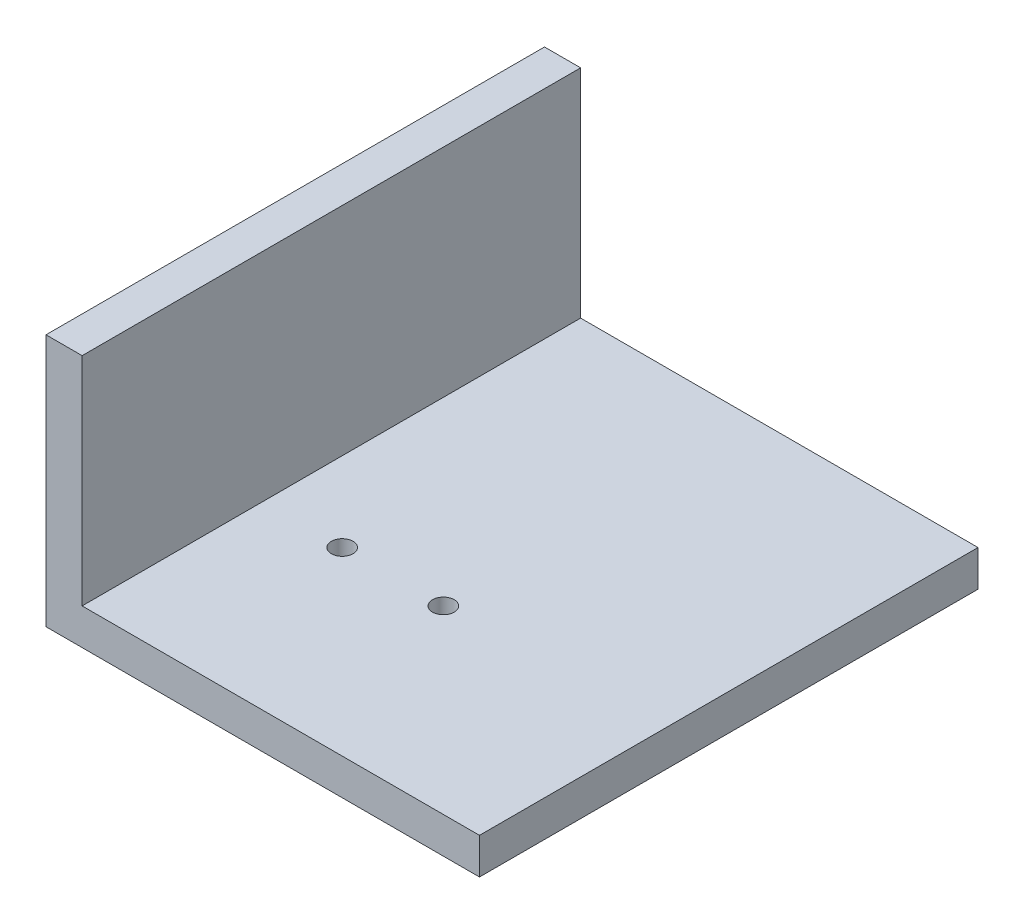
ISO-10303-21;
HEADER;
FILE_DESCRIPTION(('STEP AP214'),'2;1');
FILE_NAME('part.step','',(''),(''),'','','');
FILE_SCHEMA(('AUTOMOTIVE_DESIGN { 1 0 10303 214 1 1 1 1 }'));
ENDSEC;
DATA;
#1=APPLICATION_CONTEXT('core data for automotive mechanical design processes');
#2=APPLICATION_PROTOCOL_DEFINITION('international standard','automotive_design',2000,#1);
#3=PRODUCT_CONTEXT('',#1,'mechanical');
#4=PRODUCT('Part','Part','',(#3));
#5=PRODUCT_RELATED_PRODUCT_CATEGORY('part','',(#4));
#6=PRODUCT_DEFINITION_FORMATION('','',#4);
#7=PRODUCT_DEFINITION_CONTEXT('part definition',#1,'design');
#8=PRODUCT_DEFINITION('design','',#6,#7);
#9=PRODUCT_DEFINITION_SHAPE('','',#8);
#10=(LENGTH_UNIT() NAMED_UNIT(*) SI_UNIT(.MILLI.,.METRE.));
#11=(NAMED_UNIT(*) PLANE_ANGLE_UNIT() SI_UNIT($,.RADIAN.));
#12=(NAMED_UNIT(*) SI_UNIT($,.STERADIAN.) SOLID_ANGLE_UNIT());
#13=UNCERTAINTY_MEASURE_WITH_UNIT(LENGTH_MEASURE(1.E-05),#10,'distance_accuracy_value','');
#14=(GEOMETRIC_REPRESENTATION_CONTEXT(3) GLOBAL_UNCERTAINTY_ASSIGNED_CONTEXT((#13)) GLOBAL_UNIT_ASSIGNED_CONTEXT((#10,
#11,#12)) REPRESENTATION_CONTEXT('',''));
#15=CARTESIAN_POINT('',(0.,0.,0.));
#16=DIRECTION('',(0.,0.,1.));
#17=DIRECTION('',(1.,0.,0.));
#18=AXIS2_PLACEMENT_3D('',#15,#16,#17);
#19=CARTESIAN_POINT('',(0.,5.,0.));
#20=DIRECTION('',(0.,1.,0.));
#21=DIRECTION('',(0.,0.,1.));
#22=AXIS2_PLACEMENT_3D('',#19,#20,#21);
#23=PLANE('',#22);
#24=DIRECTION('',(0.,0.,-1.));
#25=VECTOR('',#24,1.);
#26=CARTESIAN_POINT('',(-11.,5.,-44.));
#27=LINE('',#26,#25);
#28=CARTESIAN_POINT('',(-11.,5.,25.));
#29=VERTEX_POINT('',#28);
#30=CARTESIAN_POINT('',(-11.,5.,-44.));
#31=VERTEX_POINT('',#30);
#32=EDGE_CURVE('E58',#29,#31,#27,.T.);
#33=ORIENTED_EDGE('',*,*,#32,.F.);
#34=DIRECTION('',(1.,0.,0.));
#35=VECTOR('',#34,1.);
#36=CARTESIAN_POINT('',(44.,5.,25.));
#37=LINE('',#36,#35);
#38=CARTESIAN_POINT('',(44.,5.,25.));
#39=VERTEX_POINT('',#38);
#40=EDGE_CURVE('E110',#29,#39,#37,.T.);
#41=ORIENTED_EDGE('',*,*,#40,.T.);
#42=DIRECTION('',(0.,0.,-1.));
#43=VECTOR('',#42,1.);
#44=CARTESIAN_POINT('',(44.,5.,25.));
#45=LINE('',#44,#43);
#46=CARTESIAN_POINT('',(44.,5.,-44.));
#47=VERTEX_POINT('',#46);
#48=EDGE_CURVE('E64',#39,#47,#45,.T.);
#49=ORIENTED_EDGE('',*,*,#48,.T.);
#50=DIRECTION('',(-1.,0.,0.));
#51=VECTOR('',#50,1.);
#52=CARTESIAN_POINT('',(14.,5.,-44.));
#53=LINE('',#52,#51);
#54=EDGE_CURVE('E104',#47,#31,#53,.T.);
#55=ORIENTED_EDGE('',*,*,#54,.T.);
#56=EDGE_LOOP('',(#33,#41,#49,#55));
#57=FACE_BOUND('',#56,.T.);
#58=CARTESIAN_POINT('',(0.,5.,0.));
#59=DIRECTION('',(0.,1.,0.));
#60=DIRECTION('',(0.,0.,1.));
#61=AXIS2_PLACEMENT_3D('',#58,#59,#60);
#62=CIRCLE('',#61,1.5);
#63=CARTESIAN_POINT('',(0.,5.,1.5));
#64=VERTEX_POINT('',#63);
#65=EDGE_CURVE('E123',#64,#64,#62,.T.);
#66=ORIENTED_EDGE('',*,*,#65,.F.);
#67=EDGE_LOOP('',(#66));
#68=FACE_BOUND('',#67,.T.);
#69=CARTESIAN_POINT('',(14.,5.,0.));
#70=DIRECTION('',(0.,1.,0.));
#71=DIRECTION('',(0.,0.,1.));
#72=AXIS2_PLACEMENT_3D('',#69,#70,#71);
#73=CIRCLE('',#72,1.5);
#74=CARTESIAN_POINT('',(14.,5.,1.5));
#75=VERTEX_POINT('',#74);
#76=EDGE_CURVE('E132',#75,#75,#73,.T.);
#77=ORIENTED_EDGE('',*,*,#76,.F.);
#78=EDGE_LOOP('',(#77));
#79=FACE_BOUND('',#78,.T.);
#80=ADVANCED_FACE('F43',(#57,#68,#79),#23,.T.);
#81=CARTESIAN_POINT('',(0.,0.,0.));
#82=DIRECTION('',(0.,1.,0.));
#83=DIRECTION('',(0.,0.,1.));
#84=AXIS2_PLACEMENT_3D('',#81,#82,#83);
#85=PLANE('',#84);
#86=DIRECTION('',(1.,0.,0.));
#87=VECTOR('',#86,1.);
#88=CARTESIAN_POINT('',(44.,0.,25.));
#89=LINE('',#88,#87);
#90=CARTESIAN_POINT('',(-16.,0.,25.));
#91=VERTEX_POINT('',#90);
#92=CARTESIAN_POINT('',(44.,0.,25.));
#93=VERTEX_POINT('',#92);
#94=EDGE_CURVE('E109',#91,#93,#89,.T.);
#95=ORIENTED_EDGE('',*,*,#94,.F.);
#96=DIRECTION('',(0.,0.,1.));
#97=VECTOR('',#96,1.);
#98=CARTESIAN_POINT('',(-16.,0.,0.));
#99=LINE('',#98,#97);
#100=CARTESIAN_POINT('',(-16.,0.,-44.));
#101=VERTEX_POINT('',#100);
#102=EDGE_CURVE('E94',#101,#91,#99,.T.);
#103=ORIENTED_EDGE('',*,*,#102,.F.);
#104=DIRECTION('',(-1.,0.,0.));
#105=VECTOR('',#104,1.);
#106=CARTESIAN_POINT('',(14.,0.,-44.));
#107=LINE('',#106,#105);
#108=CARTESIAN_POINT('',(44.,0.,-44.));
#109=VERTEX_POINT('',#108);
#110=EDGE_CURVE('E83',#109,#101,#107,.T.);
#111=ORIENTED_EDGE('',*,*,#110,.F.);
#112=DIRECTION('',(0.,0.,-1.));
#113=VECTOR('',#112,1.);
#114=CARTESIAN_POINT('',(44.,0.,-44.));
#115=LINE('',#114,#113);
#116=EDGE_CURVE('E95',#93,#109,#115,.T.);
#117=ORIENTED_EDGE('',*,*,#116,.F.);
#118=EDGE_LOOP('',(#95,#103,#111,#117));
#119=FACE_BOUND('',#118,.T.);
#120=CARTESIAN_POINT('',(0.,0.,0.));
#121=DIRECTION('',(0.,1.,0.));
#122=DIRECTION('',(0.,0.,1.));
#123=AXIS2_PLACEMENT_3D('',#120,#121,#122);
#124=CIRCLE('',#123,1.5);
#125=CARTESIAN_POINT('',(0.,0.,1.5));
#126=VERTEX_POINT('',#125);
#127=EDGE_CURVE('E126',#126,#126,#124,.T.);
#128=ORIENTED_EDGE('',*,*,#127,.T.);
#129=EDGE_LOOP('',(#128));
#130=FACE_BOUND('',#129,.T.);
#131=CARTESIAN_POINT('',(14.,0.,0.));
#132=DIRECTION('',(0.,1.,0.));
#133=DIRECTION('',(0.,0.,1.));
#134=AXIS2_PLACEMENT_3D('',#131,#132,#133);
#135=CIRCLE('',#134,1.5);
#136=CARTESIAN_POINT('',(14.,0.,1.5));
#137=VERTEX_POINT('',#136);
#138=EDGE_CURVE('E134',#137,#137,#135,.T.);
#139=ORIENTED_EDGE('',*,*,#138,.T.);
#140=EDGE_LOOP('',(#139));
#141=FACE_BOUND('',#140,.T.);
#142=ADVANCED_FACE('F106',(#119,#130,#141),#85,.F.);
#143=CARTESIAN_POINT('',(44.,5.,25.));
#144=DIRECTION('',(0.,0.,-1.));
#145=DIRECTION('',(-1.,0.,0.));
#146=AXIS2_PLACEMENT_3D('',#143,#144,#145);
#147=PLANE('',#146);
#148=ORIENTED_EDGE('',*,*,#94,.T.);
#149=DIRECTION('',(0.,-1.,0.));
#150=VECTOR('',#149,1.);
#151=CARTESIAN_POINT('',(44.,5.,25.));
#152=LINE('',#151,#150);
#153=EDGE_CURVE('E51',#39,#93,#152,.T.);
#154=ORIENTED_EDGE('',*,*,#153,.F.);
#155=ORIENTED_EDGE('',*,*,#40,.F.);
#156=DIRECTION('',(0.,-1.,0.));
#157=VECTOR('',#156,1.);
#158=CARTESIAN_POINT('',(-11.,35.,25.));
#159=LINE('',#158,#157);
#160=CARTESIAN_POINT('',(-11.,35.,25.));
#161=VERTEX_POINT('',#160);
#162=EDGE_CURVE('E137',#161,#29,#159,.T.);
#163=ORIENTED_EDGE('',*,*,#162,.F.);
#164=DIRECTION('',(1.,0.,0.));
#165=VECTOR('',#164,1.);
#166=CARTESIAN_POINT('',(-16.,35.,25.));
#167=LINE('',#166,#165);
#168=CARTESIAN_POINT('',(-16.,35.,25.));
#169=VERTEX_POINT('',#168);
#170=EDGE_CURVE('E150',#169,#161,#167,.T.);
#171=ORIENTED_EDGE('',*,*,#170,.F.);
#172=DIRECTION('',(0.,-1.,0.));
#173=VECTOR('',#172,1.);
#174=CARTESIAN_POINT('',(-16.,5.,25.));
#175=LINE('',#174,#173);
#176=EDGE_CURVE('E11',#169,#91,#175,.T.);
#177=ORIENTED_EDGE('',*,*,#176,.T.);
#178=EDGE_LOOP('',(#148,#154,#155,#163,#171,#177));
#179=FACE_BOUND('',#178,.T.);
#180=ADVANCED_FACE('F45',(#179),#147,.F.);
#181=CARTESIAN_POINT('',(44.,5.,-44.));
#182=DIRECTION('',(-1.,0.,0.));
#183=DIRECTION('',(0.,0.,1.));
#184=AXIS2_PLACEMENT_3D('',#181,#182,#183);
#185=PLANE('',#184);
#186=ORIENTED_EDGE('',*,*,#116,.T.);
#187=DIRECTION('',(0.,-1.,0.));
#188=VECTOR('',#187,1.);
#189=CARTESIAN_POINT('',(44.,5.,-44.));
#190=LINE('',#189,#188);
#191=EDGE_CURVE('E90',#47,#109,#190,.T.);
#192=ORIENTED_EDGE('',*,*,#191,.F.);
#193=ORIENTED_EDGE('',*,*,#48,.F.);
#194=ORIENTED_EDGE('',*,*,#153,.T.);
#195=EDGE_LOOP('',(#186,#192,#193,#194));
#196=FACE_BOUND('',#195,.T.);
#197=ADVANCED_FACE('F118',(#196),#185,.F.);
#198=CARTESIAN_POINT('',(14.,5.,-44.));
#199=DIRECTION('',(0.,0.,1.));
#200=DIRECTION('',(1.,0.,0.));
#201=AXIS2_PLACEMENT_3D('',#198,#199,#200);
#202=PLANE('',#201);
#203=ORIENTED_EDGE('',*,*,#110,.T.);
#204=DIRECTION('',(0.,-1.,0.));
#205=VECTOR('',#204,1.);
#206=CARTESIAN_POINT('',(-16.,5.,-44.));
#207=LINE('',#206,#205);
#208=CARTESIAN_POINT('',(-16.,35.,-44.));
#209=VERTEX_POINT('',#208);
#210=EDGE_CURVE('E87',#209,#101,#207,.T.);
#211=ORIENTED_EDGE('',*,*,#210,.F.);
#212=DIRECTION('',(-1.,0.,0.));
#213=VECTOR('',#212,1.);
#214=CARTESIAN_POINT('',(-16.,35.,-44.));
#215=LINE('',#214,#213);
#216=CARTESIAN_POINT('',(-11.,35.,-44.));
#217=VERTEX_POINT('',#216);
#218=EDGE_CURVE('E144',#217,#209,#215,.T.);
#219=ORIENTED_EDGE('',*,*,#218,.F.);
#220=DIRECTION('',(0.,-1.,0.));
#221=VECTOR('',#220,1.);
#222=CARTESIAN_POINT('',(-11.,35.,-44.));
#223=LINE('',#222,#221);
#224=EDGE_CURVE('E141',#217,#31,#223,.T.);
#225=ORIENTED_EDGE('',*,*,#224,.T.);
#226=ORIENTED_EDGE('',*,*,#54,.F.);
#227=ORIENTED_EDGE('',*,*,#191,.T.);
#228=EDGE_LOOP('',(#203,#211,#219,#225,#226,#227));
#229=FACE_BOUND('',#228,.T.);
#230=ADVANCED_FACE('F85',(#229),#202,.F.);
#231=CARTESIAN_POINT('',(-16.,5.,0.));
#232=DIRECTION('',(1.,0.,0.));
#233=DIRECTION('',(0.,0.,-1.));
#234=AXIS2_PLACEMENT_3D('',#231,#232,#233);
#235=PLANE('',#234);
#236=ORIENTED_EDGE('',*,*,#102,.T.);
#237=ORIENTED_EDGE('',*,*,#176,.F.);
#238=DIRECTION('',(0.,0.,1.));
#239=VECTOR('',#238,1.);
#240=CARTESIAN_POINT('',(-16.,35.,-44.));
#241=LINE('',#240,#239);
#242=EDGE_CURVE('E103',#209,#169,#241,.T.);
#243=ORIENTED_EDGE('',*,*,#242,.F.);
#244=ORIENTED_EDGE('',*,*,#210,.T.);
#245=EDGE_LOOP('',(#236,#237,#243,#244));
#246=FACE_BOUND('',#245,.T.);
#247=ADVANCED_FACE('F99',(#246),#235,.F.);
#248=CARTESIAN_POINT('',(0.,5.,0.));
#249=DIRECTION('',(0.,-1.,0.));
#250=DIRECTION('',(0.,0.,-1.));
#251=AXIS2_PLACEMENT_3D('',#248,#249,#250);
#252=CYLINDRICAL_SURFACE('',#251,1.5);
#253=ORIENTED_EDGE('',*,*,#65,.T.);
#254=EDGE_LOOP('',(#253));
#255=FACE_BOUND('',#254,.T.);
#256=ORIENTED_EDGE('',*,*,#127,.F.);
#257=EDGE_LOOP('',(#256));
#258=FACE_BOUND('',#257,.T.);
#259=ADVANCED_FACE('F177',(#255,#258),#252,.F.);
#260=CARTESIAN_POINT('',(14.,5.,0.));
#261=DIRECTION('',(0.,-1.,0.));
#262=DIRECTION('',(0.,0.,-1.));
#263=AXIS2_PLACEMENT_3D('',#260,#261,#262);
#264=CYLINDRICAL_SURFACE('',#263,1.5);
#265=ORIENTED_EDGE('',*,*,#76,.T.);
#266=EDGE_LOOP('',(#265));
#267=FACE_BOUND('',#266,.T.);
#268=ORIENTED_EDGE('',*,*,#138,.F.);
#269=EDGE_LOOP('',(#268));
#270=FACE_BOUND('',#269,.T.);
#271=ADVANCED_FACE('F174',(#267,#270),#264,.F.);
#272=CARTESIAN_POINT('',(-11.,35.,-44.));
#273=DIRECTION('',(-1.,0.,0.));
#274=DIRECTION('',(0.,0.,1.));
#275=AXIS2_PLACEMENT_3D('',#272,#273,#274);
#276=PLANE('',#275);
#277=ORIENTED_EDGE('',*,*,#32,.T.);
#278=ORIENTED_EDGE('',*,*,#224,.F.);
#279=DIRECTION('',(0.,0.,-1.));
#280=VECTOR('',#279,1.);
#281=CARTESIAN_POINT('',(-11.,35.,-44.));
#282=LINE('',#281,#280);
#283=EDGE_CURVE('E147',#161,#217,#282,.T.);
#284=ORIENTED_EDGE('',*,*,#283,.F.);
#285=ORIENTED_EDGE('',*,*,#162,.T.);
#286=EDGE_LOOP('',(#277,#278,#284,#285));
#287=FACE_BOUND('',#286,.T.);
#288=ADVANCED_FACE('F166',(#287),#276,.F.);
#289=CARTESIAN_POINT('',(0.,35.,0.));
#290=DIRECTION('',(0.,1.,0.));
#291=DIRECTION('',(0.,0.,1.));
#292=AXIS2_PLACEMENT_3D('',#289,#290,#291);
#293=PLANE('',#292);
#294=ORIENTED_EDGE('',*,*,#242,.T.);
#295=ORIENTED_EDGE('',*,*,#170,.T.);
#296=ORIENTED_EDGE('',*,*,#283,.T.);
#297=ORIENTED_EDGE('',*,*,#218,.T.);
#298=EDGE_LOOP('',(#294,#295,#296,#297));
#299=FACE_BOUND('',#298,.T.);
#300=ADVANCED_FACE('F155',(#299),#293,.T.);
#301=CLOSED_SHELL('',(#80,#142,#180,#197,#230,#247,#259,#271,#288,#300));
#302=MANIFOLD_SOLID_BREP('B2',#301);
#303=ADVANCED_BREP_SHAPE_REPRESENTATION('',(#18,#302),#14);
#304=SHAPE_DEFINITION_REPRESENTATION(#9,#303);
ENDSEC;
END-ISO-10303-21;
